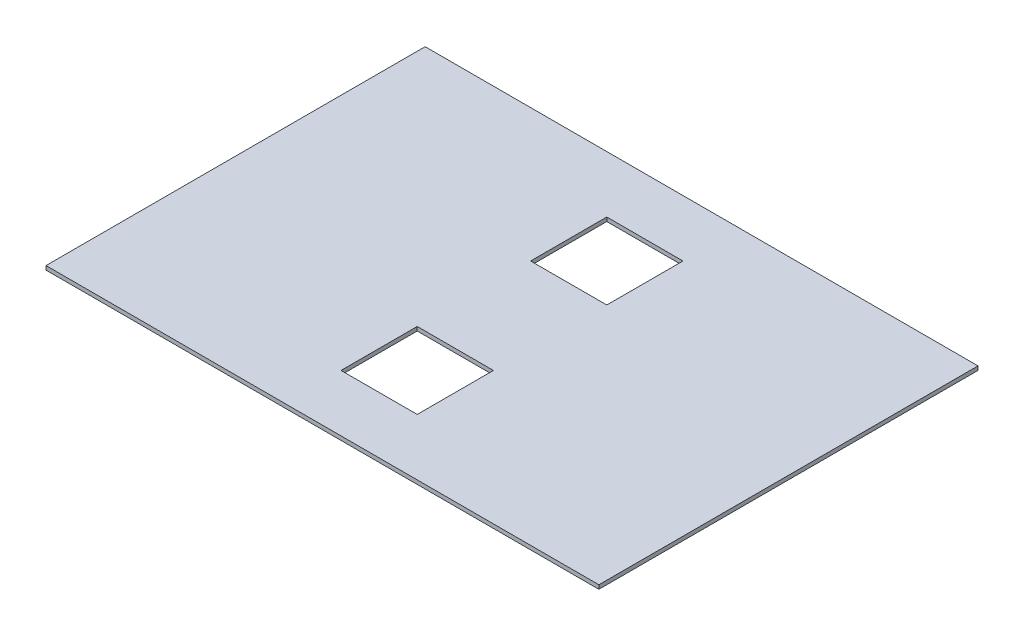
ISO-10303-21;
HEADER;
FILE_DESCRIPTION(('STEP AP214'),'2;1');
FILE_NAME('part.step','',(''),(''),'','','');
FILE_SCHEMA(('AUTOMOTIVE_DESIGN { 1 0 10303 214 1 1 1 1 }'));
ENDSEC;
DATA;
#1=APPLICATION_CONTEXT('core data for automotive mechanical design processes');
#2=APPLICATION_PROTOCOL_DEFINITION('international standard','automotive_design',2000,#1);
#3=PRODUCT_CONTEXT('',#1,'mechanical');
#4=PRODUCT('Part','Part','',(#3));
#5=PRODUCT_RELATED_PRODUCT_CATEGORY('part','',(#4));
#6=PRODUCT_DEFINITION_FORMATION('','',#4);
#7=PRODUCT_DEFINITION_CONTEXT('part definition',#1,'design');
#8=PRODUCT_DEFINITION('design','',#6,#7);
#9=PRODUCT_DEFINITION_SHAPE('','',#8);
#10=(LENGTH_UNIT() NAMED_UNIT(*) SI_UNIT(.MILLI.,.METRE.));
#11=(NAMED_UNIT(*) PLANE_ANGLE_UNIT() SI_UNIT($,.RADIAN.));
#12=(NAMED_UNIT(*) SI_UNIT($,.STERADIAN.) SOLID_ANGLE_UNIT());
#13=UNCERTAINTY_MEASURE_WITH_UNIT(LENGTH_MEASURE(1.E-05),#10,'distance_accuracy_value','');
#14=(GEOMETRIC_REPRESENTATION_CONTEXT(3) GLOBAL_UNCERTAINTY_ASSIGNED_CONTEXT((#13)) GLOBAL_UNIT_ASSIGNED_CONTEXT((#10,
#11,#12)) REPRESENTATION_CONTEXT('',''));
#15=CARTESIAN_POINT('',(0.,0.,0.));
#16=DIRECTION('',(0.,0.,1.));
#17=DIRECTION('',(1.,0.,0.));
#18=AXIS2_PLACEMENT_3D('',#15,#16,#17);
#19=CARTESIAN_POINT('',(444.5,6.35,304.8));
#20=DIRECTION('',(-1.,0.,0.));
#21=DIRECTION('',(0.,0.,1.));
#22=AXIS2_PLACEMENT_3D('',#19,#20,#21);
#23=PLANE('',#22);
#24=DIRECTION('',(0.,0.,-1.));
#25=VECTOR('',#24,1.);
#26=CARTESIAN_POINT('',(444.5,0.,304.8));
#27=LINE('',#26,#25);
#28=CARTESIAN_POINT('',(444.5,0.,304.8));
#29=VERTEX_POINT('',#28);
#30=CARTESIAN_POINT('',(444.5,0.,-304.8));
#31=VERTEX_POINT('',#30);
#32=EDGE_CURVE('E177',#29,#31,#27,.T.);
#33=ORIENTED_EDGE('',*,*,#32,.T.);
#34=DIRECTION('',(0.,-1.,0.));
#35=VECTOR('',#34,1.);
#36=CARTESIAN_POINT('',(444.5,6.35,-304.8));
#37=LINE('',#36,#35);
#38=CARTESIAN_POINT('',(444.5,6.35,-304.8));
#39=VERTEX_POINT('',#38);
#40=EDGE_CURVE('E11',#39,#31,#37,.T.);
#41=ORIENTED_EDGE('',*,*,#40,.F.);
#42=DIRECTION('',(0.,0.,-1.));
#43=VECTOR('',#42,1.);
#44=CARTESIAN_POINT('',(444.5,6.35,304.8));
#45=LINE('',#44,#43);
#46=CARTESIAN_POINT('',(444.5,6.35,304.8));
#47=VERTEX_POINT('',#46);
#48=EDGE_CURVE('E225',#47,#39,#45,.T.);
#49=ORIENTED_EDGE('',*,*,#48,.F.);
#50=DIRECTION('',(0.,-1.,0.));
#51=VECTOR('',#50,1.);
#52=CARTESIAN_POINT('',(444.5,6.35,304.8));
#53=LINE('',#52,#51);
#54=EDGE_CURVE('E239',#47,#29,#53,.T.);
#55=ORIENTED_EDGE('',*,*,#54,.T.);
#56=EDGE_LOOP('',(#33,#41,#49,#55));
#57=FACE_BOUND('',#56,.T.);
#58=ADVANCED_FACE('F42',(#57),#23,.F.);
#59=CARTESIAN_POINT('',(-444.5,6.35,-304.8));
#60=DIRECTION('',(0.,0.,1.));
#61=DIRECTION('',(1.,0.,0.));
#62=AXIS2_PLACEMENT_3D('',#59,#60,#61);
#63=PLANE('',#62);
#64=DIRECTION('',(-1.,0.,0.));
#65=VECTOR('',#64,1.);
#66=CARTESIAN_POINT('',(-444.5,0.,-304.8));
#67=LINE('',#66,#65);
#68=CARTESIAN_POINT('',(-444.5,0.,-304.8));
#69=VERTEX_POINT('',#68);
#70=EDGE_CURVE('E243',#31,#69,#67,.T.);
#71=ORIENTED_EDGE('',*,*,#70,.T.);
#72=DIRECTION('',(0.,-1.,0.));
#73=VECTOR('',#72,1.);
#74=CARTESIAN_POINT('',(-444.5,6.35,-304.8));
#75=LINE('',#74,#73);
#76=CARTESIAN_POINT('',(-444.5,6.35,-304.8));
#77=VERTEX_POINT('',#76);
#78=EDGE_CURVE('E50',#77,#69,#75,.T.);
#79=ORIENTED_EDGE('',*,*,#78,.F.);
#80=DIRECTION('',(-1.,0.,0.));
#81=VECTOR('',#80,1.);
#82=CARTESIAN_POINT('',(-444.5,6.35,-304.8));
#83=LINE('',#82,#81);
#84=EDGE_CURVE('E229',#39,#77,#83,.T.);
#85=ORIENTED_EDGE('',*,*,#84,.F.);
#86=ORIENTED_EDGE('',*,*,#40,.T.);
#87=EDGE_LOOP('',(#71,#79,#85,#86));
#88=FACE_BOUND('',#87,.T.);
#89=ADVANCED_FACE('F278',(#88),#63,.F.);
#90=CARTESIAN_POINT('',(-444.5,6.35,304.8));
#91=DIRECTION('',(1.,0.,0.));
#92=DIRECTION('',(0.,0.,-1.));
#93=AXIS2_PLACEMENT_3D('',#90,#91,#92);
#94=PLANE('',#93);
#95=DIRECTION('',(0.,0.,1.));
#96=VECTOR('',#95,1.);
#97=CARTESIAN_POINT('',(-444.5,0.,304.8));
#98=LINE('',#97,#96);
#99=CARTESIAN_POINT('',(-444.5,0.,304.8));
#100=VERTEX_POINT('',#99);
#101=EDGE_CURVE('E246',#69,#100,#98,.T.);
#102=ORIENTED_EDGE('',*,*,#101,.T.);
#103=DIRECTION('',(0.,-1.,0.));
#104=VECTOR('',#103,1.);
#105=CARTESIAN_POINT('',(-444.5,6.35,304.8));
#106=LINE('',#105,#104);
#107=CARTESIAN_POINT('',(-444.5,6.35,304.8));
#108=VERTEX_POINT('',#107);
#109=EDGE_CURVE('E254',#108,#100,#106,.T.);
#110=ORIENTED_EDGE('',*,*,#109,.F.);
#111=DIRECTION('',(0.,0.,1.));
#112=VECTOR('',#111,1.);
#113=CARTESIAN_POINT('',(-444.5,6.35,304.8));
#114=LINE('',#113,#112);
#115=EDGE_CURVE('E233',#77,#108,#114,.T.);
#116=ORIENTED_EDGE('',*,*,#115,.F.);
#117=ORIENTED_EDGE('',*,*,#78,.T.);
#118=EDGE_LOOP('',(#102,#110,#116,#117));
#119=FACE_BOUND('',#118,.T.);
#120=ADVANCED_FACE('F263',(#119),#94,.F.);
#121=CARTESIAN_POINT('',(-444.5,6.35,304.8));
#122=DIRECTION('',(0.,0.,-1.));
#123=DIRECTION('',(-1.,0.,0.));
#124=AXIS2_PLACEMENT_3D('',#121,#122,#123);
#125=PLANE('',#124);
#126=DIRECTION('',(1.,0.,0.));
#127=VECTOR('',#126,1.);
#128=CARTESIAN_POINT('',(-444.5,0.,304.8));
#129=LINE('',#128,#127);
#130=EDGE_CURVE('E230',#100,#29,#129,.T.);
#131=ORIENTED_EDGE('',*,*,#130,.T.);
#132=ORIENTED_EDGE('',*,*,#54,.F.);
#133=DIRECTION('',(1.,0.,0.));
#134=VECTOR('',#133,1.);
#135=CARTESIAN_POINT('',(-444.5,6.35,304.8));
#136=LINE('',#135,#134);
#137=EDGE_CURVE('E236',#108,#47,#136,.T.);
#138=ORIENTED_EDGE('',*,*,#137,.F.);
#139=ORIENTED_EDGE('',*,*,#109,.T.);
#140=EDGE_LOOP('',(#131,#132,#138,#139));
#141=FACE_BOUND('',#140,.T.);
#142=ADVANCED_FACE('F271',(#141),#125,.F.);
#143=CARTESIAN_POINT('',(0.,6.35,0.));
#144=DIRECTION('',(0.,-1.,0.));
#145=DIRECTION('',(0.,0.,-1.));
#146=AXIS2_PLACEMENT_3D('',#143,#144,#145);
#147=PLANE('',#146);
#148=DIRECTION('',(-1.,0.,0.));
#149=VECTOR('',#148,1.);
#150=CARTESIAN_POINT('',(-61.25,6.35,-213.65));
#151=LINE('',#150,#149);
#152=CARTESIAN_POINT('',(61.25,6.35,-213.65));
#153=VERTEX_POINT('',#152);
#154=CARTESIAN_POINT('',(-61.25,6.35,-213.65));
#155=VERTEX_POINT('',#154);
#156=EDGE_CURVE('E168',#153,#155,#151,.T.);
#157=ORIENTED_EDGE('',*,*,#156,.F.);
#158=DIRECTION('',(0.,0.,-1.));
#159=VECTOR('',#158,1.);
#160=CARTESIAN_POINT('',(61.25,6.35,-213.65));
#161=LINE('',#160,#159);
#162=CARTESIAN_POINT('',(61.25,6.35,-91.15));
#163=VERTEX_POINT('',#162);
#164=EDGE_CURVE('E57',#163,#153,#161,.T.);
#165=ORIENTED_EDGE('',*,*,#164,.F.);
#166=DIRECTION('',(1.,0.,0.));
#167=VECTOR('',#166,1.);
#168=CARTESIAN_POINT('',(-61.25,6.35,-91.15));
#169=LINE('',#168,#167);
#170=CARTESIAN_POINT('',(-61.25,6.35,-91.15));
#171=VERTEX_POINT('',#170);
#172=EDGE_CURVE('E155',#171,#163,#169,.T.);
#173=ORIENTED_EDGE('',*,*,#172,.F.);
#174=DIRECTION('',(0.,0.,1.));
#175=VECTOR('',#174,1.);
#176=CARTESIAN_POINT('',(-61.25,6.35,-213.65));
#177=LINE('',#176,#175);
#178=EDGE_CURVE('E159',#155,#171,#177,.T.);
#179=ORIENTED_EDGE('',*,*,#178,.F.);
#180=EDGE_LOOP('',(#157,#165,#173,#179));
#181=FACE_BOUND('',#180,.T.);
#182=DIRECTION('',(1.,0.,0.));
#183=VECTOR('',#182,1.);
#184=CARTESIAN_POINT('',(-61.2500000000002,6.35,213.65));
#185=LINE('',#184,#183);
#186=CARTESIAN_POINT('',(-61.2500000000002,6.35,213.65));
#187=VERTEX_POINT('',#186);
#188=CARTESIAN_POINT('',(61.2499999999998,6.35,213.65));
#189=VERTEX_POINT('',#188);
#190=EDGE_CURVE('E205',#187,#189,#185,.T.);
#191=ORIENTED_EDGE('',*,*,#190,.F.);
#192=DIRECTION('',(0.,0.,1.));
#193=VECTOR('',#192,1.);
#194=CARTESIAN_POINT('',(-61.2500000000002,6.35,213.65));
#195=LINE('',#194,#193);
#196=CARTESIAN_POINT('',(-61.2500000000001,6.35,91.1499999999999));
#197=VERTEX_POINT('',#196);
#198=EDGE_CURVE('E65',#197,#187,#195,.T.);
#199=ORIENTED_EDGE('',*,*,#198,.F.);
#200=DIRECTION('',(-1.,0.,0.));
#201=VECTOR('',#200,1.);
#202=CARTESIAN_POINT('',(-61.2500000000001,6.35,91.1499999999999));
#203=LINE('',#202,#201);
#204=CARTESIAN_POINT('',(61.2499999999999,6.35,91.1500000000001));
#205=VERTEX_POINT('',#204);
#206=EDGE_CURVE('E196',#205,#197,#203,.T.);
#207=ORIENTED_EDGE('',*,*,#206,.F.);
#208=DIRECTION('',(0.,0.,-1.));
#209=VECTOR('',#208,1.);
#210=CARTESIAN_POINT('',(61.2499999999998,6.35,213.65));
#211=LINE('',#210,#209);
#212=EDGE_CURVE('E200',#189,#205,#211,.T.);
#213=ORIENTED_EDGE('',*,*,#212,.F.);
#214=EDGE_LOOP('',(#191,#199,#207,#213));
#215=FACE_BOUND('',#214,.T.);
#216=ORIENTED_EDGE('',*,*,#48,.T.);
#217=ORIENTED_EDGE('',*,*,#84,.T.);
#218=ORIENTED_EDGE('',*,*,#115,.T.);
#219=ORIENTED_EDGE('',*,*,#137,.T.);
#220=EDGE_LOOP('',(#216,#217,#218,#219));
#221=FACE_BOUND('',#220,.T.);
#222=ADVANCED_FACE('F277',(#181,#215,#221),#147,.F.);
#223=CARTESIAN_POINT('',(0.,0.,0.));
#224=DIRECTION('',(0.,-1.,0.));
#225=DIRECTION('',(0.,0.,-1.));
#226=AXIS2_PLACEMENT_3D('',#223,#224,#225);
#227=PLANE('',#226);
#228=DIRECTION('',(0.,0.,-1.));
#229=VECTOR('',#228,1.);
#230=CARTESIAN_POINT('',(61.25,0.,-213.65));
#231=LINE('',#230,#229);
#232=CARTESIAN_POINT('',(61.25,0.,-91.15));
#233=VERTEX_POINT('',#232);
#234=CARTESIAN_POINT('',(61.25,0.,-213.65));
#235=VERTEX_POINT('',#234);
#236=EDGE_CURVE('E133',#233,#235,#231,.T.);
#237=ORIENTED_EDGE('',*,*,#236,.T.);
#238=DIRECTION('',(-1.,0.,0.));
#239=VECTOR('',#238,1.);
#240=CARTESIAN_POINT('',(-61.25,0.,-213.65));
#241=LINE('',#240,#239);
#242=CARTESIAN_POINT('',(-61.25,0.,-213.65));
#243=VERTEX_POINT('',#242);
#244=EDGE_CURVE('E144',#235,#243,#241,.T.);
#245=ORIENTED_EDGE('',*,*,#244,.T.);
#246=DIRECTION('',(0.,0.,1.));
#247=VECTOR('',#246,1.);
#248=CARTESIAN_POINT('',(-61.25,0.,-213.65));
#249=LINE('',#248,#247);
#250=CARTESIAN_POINT('',(-61.25,0.,-91.15));
#251=VERTEX_POINT('',#250);
#252=EDGE_CURVE('E149',#243,#251,#249,.T.);
#253=ORIENTED_EDGE('',*,*,#252,.T.);
#254=DIRECTION('',(1.,0.,0.));
#255=VECTOR('',#254,1.);
#256=CARTESIAN_POINT('',(-61.25,0.,-91.15));
#257=LINE('',#256,#255);
#258=EDGE_CURVE('E140',#251,#233,#257,.T.);
#259=ORIENTED_EDGE('',*,*,#258,.T.);
#260=EDGE_LOOP('',(#237,#245,#253,#259));
#261=FACE_BOUND('',#260,.T.);
#262=DIRECTION('',(0.,0.,1.));
#263=VECTOR('',#262,1.);
#264=CARTESIAN_POINT('',(-61.2500000000002,0.,213.65));
#265=LINE('',#264,#263);
#266=CARTESIAN_POINT('',(-61.2500000000001,0.,91.1499999999999));
#267=VERTEX_POINT('',#266);
#268=CARTESIAN_POINT('',(-61.2500000000002,0.,213.65));
#269=VERTEX_POINT('',#268);
#270=EDGE_CURVE('E201',#267,#269,#265,.T.);
#271=ORIENTED_EDGE('',*,*,#270,.T.);
#272=DIRECTION('',(1.,0.,0.));
#273=VECTOR('',#272,1.);
#274=CARTESIAN_POINT('',(-61.2500000000002,0.,213.65));
#275=LINE('',#274,#273);
#276=CARTESIAN_POINT('',(61.2499999999998,0.,213.65));
#277=VERTEX_POINT('',#276);
#278=EDGE_CURVE('E218',#269,#277,#275,.T.);
#279=ORIENTED_EDGE('',*,*,#278,.T.);
#280=DIRECTION('',(0.,0.,-1.));
#281=VECTOR('',#280,1.);
#282=CARTESIAN_POINT('',(61.2499999999998,0.,213.65));
#283=LINE('',#282,#281);
#284=CARTESIAN_POINT('',(61.2499999999999,0.,91.1500000000001));
#285=VERTEX_POINT('',#284);
#286=EDGE_CURVE('E214',#277,#285,#283,.T.);
#287=ORIENTED_EDGE('',*,*,#286,.T.);
#288=DIRECTION('',(-1.,0.,0.));
#289=VECTOR('',#288,1.);
#290=CARTESIAN_POINT('',(-61.2500000000001,0.,91.1499999999999));
#291=LINE('',#290,#289);
#292=EDGE_CURVE('E186',#285,#267,#291,.T.);
#293=ORIENTED_EDGE('',*,*,#292,.T.);
#294=EDGE_LOOP('',(#271,#279,#287,#293));
#295=FACE_BOUND('',#294,.T.);
#296=ORIENTED_EDGE('',*,*,#32,.F.);
#297=ORIENTED_EDGE('',*,*,#130,.F.);
#298=ORIENTED_EDGE('',*,*,#101,.F.);
#299=ORIENTED_EDGE('',*,*,#70,.F.);
#300=EDGE_LOOP('',(#296,#297,#298,#299));
#301=FACE_BOUND('',#300,.T.);
#302=ADVANCED_FACE('F151',(#261,#295,#301),#227,.T.);
#303=CARTESIAN_POINT('',(-61.2500000000002,0.,213.65));
#304=DIRECTION('',(-1.,0.,0.));
#305=DIRECTION('',(0.,0.,1.));
#306=AXIS2_PLACEMENT_3D('',#303,#304,#305);
#307=PLANE('',#306);
#308=ORIENTED_EDGE('',*,*,#198,.T.);
#309=DIRECTION('',(0.,1.,0.));
#310=VECTOR('',#309,1.);
#311=CARTESIAN_POINT('',(-61.2500000000002,0.,213.65));
#312=LINE('',#311,#310);
#313=EDGE_CURVE('E183',#269,#187,#312,.T.);
#314=ORIENTED_EDGE('',*,*,#313,.F.);
#315=ORIENTED_EDGE('',*,*,#270,.F.);
#316=DIRECTION('',(0.,1.,0.));
#317=VECTOR('',#316,1.);
#318=CARTESIAN_POINT('',(-61.2500000000001,0.,91.1499999999999));
#319=LINE('',#318,#317);
#320=EDGE_CURVE('E193',#267,#197,#319,.T.);
#321=ORIENTED_EDGE('',*,*,#320,.T.);
#322=EDGE_LOOP('',(#308,#314,#315,#321));
#323=FACE_BOUND('',#322,.T.);
#324=ADVANCED_FACE('F290',(#323),#307,.F.);
#325=CARTESIAN_POINT('',(-61.2500000000001,0.,91.1499999999999));
#326=DIRECTION('',(0.,0.,-1.));
#327=DIRECTION('',(-1.,0.,0.));
#328=AXIS2_PLACEMENT_3D('',#325,#326,#327);
#329=PLANE('',#328);
#330=ORIENTED_EDGE('',*,*,#206,.T.);
#331=ORIENTED_EDGE('',*,*,#320,.F.);
#332=ORIENTED_EDGE('',*,*,#292,.F.);
#333=DIRECTION('',(0.,1.,0.));
#334=VECTOR('',#333,1.);
#335=CARTESIAN_POINT('',(61.2499999999999,0.,91.1500000000001));
#336=LINE('',#335,#334);
#337=EDGE_CURVE('E190',#285,#205,#336,.T.);
#338=ORIENTED_EDGE('',*,*,#337,.T.);
#339=EDGE_LOOP('',(#330,#331,#332,#338));
#340=FACE_BOUND('',#339,.T.);
#341=ADVANCED_FACE('F294',(#340),#329,.F.);
#342=CARTESIAN_POINT('',(61.2499999999998,0.,213.65));
#343=DIRECTION('',(1.,0.,0.));
#344=DIRECTION('',(0.,0.,-1.));
#345=AXIS2_PLACEMENT_3D('',#342,#343,#344);
#346=PLANE('',#345);
#347=ORIENTED_EDGE('',*,*,#212,.T.);
#348=ORIENTED_EDGE('',*,*,#337,.F.);
#349=ORIENTED_EDGE('',*,*,#286,.F.);
#350=DIRECTION('',(0.,1.,0.));
#351=VECTOR('',#350,1.);
#352=CARTESIAN_POINT('',(61.2499999999998,0.,213.65));
#353=LINE('',#352,#351);
#354=EDGE_CURVE('E187',#277,#189,#353,.T.);
#355=ORIENTED_EDGE('',*,*,#354,.T.);
#356=EDGE_LOOP('',(#347,#348,#349,#355));
#357=FACE_BOUND('',#356,.T.);
#358=ADVANCED_FACE('F297',(#357),#346,.F.);
#359=CARTESIAN_POINT('',(-61.2500000000002,0.,213.65));
#360=DIRECTION('',(0.,0.,1.));
#361=DIRECTION('',(1.,0.,0.));
#362=AXIS2_PLACEMENT_3D('',#359,#360,#361);
#363=PLANE('',#362);
#364=ORIENTED_EDGE('',*,*,#190,.T.);
#365=ORIENTED_EDGE('',*,*,#354,.F.);
#366=ORIENTED_EDGE('',*,*,#278,.F.);
#367=ORIENTED_EDGE('',*,*,#313,.T.);
#368=EDGE_LOOP('',(#364,#365,#366,#367));
#369=FACE_BOUND('',#368,.T.);
#370=ADVANCED_FACE('F301',(#369),#363,.F.);
#371=CARTESIAN_POINT('',(61.25,0.,-213.65));
#372=DIRECTION('',(1.,0.,0.));
#373=DIRECTION('',(0.,0.,-1.));
#374=AXIS2_PLACEMENT_3D('',#371,#372,#373);
#375=PLANE('',#374);
#376=ORIENTED_EDGE('',*,*,#164,.T.);
#377=DIRECTION('',(0.,1.,0.));
#378=VECTOR('',#377,1.);
#379=CARTESIAN_POINT('',(61.25,0.,-213.65));
#380=LINE('',#379,#378);
#381=EDGE_CURVE('E129',#235,#153,#380,.T.);
#382=ORIENTED_EDGE('',*,*,#381,.F.);
#383=ORIENTED_EDGE('',*,*,#236,.F.);
#384=DIRECTION('',(0.,1.,0.));
#385=VECTOR('',#384,1.);
#386=CARTESIAN_POINT('',(61.25,0.,-91.15));
#387=LINE('',#386,#385);
#388=EDGE_CURVE('E174',#233,#163,#387,.T.);
#389=ORIENTED_EDGE('',*,*,#388,.T.);
#390=EDGE_LOOP('',(#376,#382,#383,#389));
#391=FACE_BOUND('',#390,.T.);
#392=ADVANCED_FACE('F131',(#391),#375,.F.);
#393=CARTESIAN_POINT('',(-61.25,0.,-91.15));
#394=DIRECTION('',(0.,0.,1.));
#395=DIRECTION('',(1.,0.,0.));
#396=AXIS2_PLACEMENT_3D('',#393,#394,#395);
#397=PLANE('',#396);
#398=ORIENTED_EDGE('',*,*,#172,.T.);
#399=ORIENTED_EDGE('',*,*,#388,.F.);
#400=ORIENTED_EDGE('',*,*,#258,.F.);
#401=DIRECTION('',(0.,1.,0.));
#402=VECTOR('',#401,1.);
#403=CARTESIAN_POINT('',(-61.25,0.,-91.15));
#404=LINE('',#403,#402);
#405=EDGE_CURVE('E178',#251,#171,#404,.T.);
#406=ORIENTED_EDGE('',*,*,#405,.T.);
#407=EDGE_LOOP('',(#398,#399,#400,#406));
#408=FACE_BOUND('',#407,.T.);
#409=ADVANCED_FACE('F310',(#408),#397,.F.);
#410=CARTESIAN_POINT('',(-61.25,0.,-213.65));
#411=DIRECTION('',(-1.,0.,0.));
#412=DIRECTION('',(0.,0.,1.));
#413=AXIS2_PLACEMENT_3D('',#410,#411,#412);
#414=PLANE('',#413);
#415=ORIENTED_EDGE('',*,*,#178,.T.);
#416=ORIENTED_EDGE('',*,*,#405,.F.);
#417=ORIENTED_EDGE('',*,*,#252,.F.);
#418=DIRECTION('',(0.,1.,0.));
#419=VECTOR('',#418,1.);
#420=CARTESIAN_POINT('',(-61.25,0.,-213.65));
#421=LINE('',#420,#419);
#422=EDGE_CURVE('E139',#243,#155,#421,.T.);
#423=ORIENTED_EDGE('',*,*,#422,.T.);
#424=EDGE_LOOP('',(#415,#416,#417,#423));
#425=FACE_BOUND('',#424,.T.);
#426=ADVANCED_FACE('F313',(#425),#414,.F.);
#427=CARTESIAN_POINT('',(-61.25,0.,-213.65));
#428=DIRECTION('',(0.,0.,-1.));
#429=DIRECTION('',(-1.,0.,0.));
#430=AXIS2_PLACEMENT_3D('',#427,#428,#429);
#431=PLANE('',#430);
#432=ORIENTED_EDGE('',*,*,#156,.T.);
#433=ORIENTED_EDGE('',*,*,#422,.F.);
#434=ORIENTED_EDGE('',*,*,#244,.F.);
#435=ORIENTED_EDGE('',*,*,#381,.T.);
#436=EDGE_LOOP('',(#432,#433,#434,#435));
#437=FACE_BOUND('',#436,.T.);
#438=ADVANCED_FACE('F145',(#437),#431,.F.);
#439=CLOSED_SHELL('',(#58,#89,#120,#142,#222,#302,#324,#341,#358,#370,#392,#409,#426,#438));
#440=MANIFOLD_SOLID_BREP('B2',#439);
#441=ADVANCED_BREP_SHAPE_REPRESENTATION('',(#18,#440),#14);
#442=SHAPE_DEFINITION_REPRESENTATION(#9,#441);
ENDSEC;
END-ISO-10303-21;
